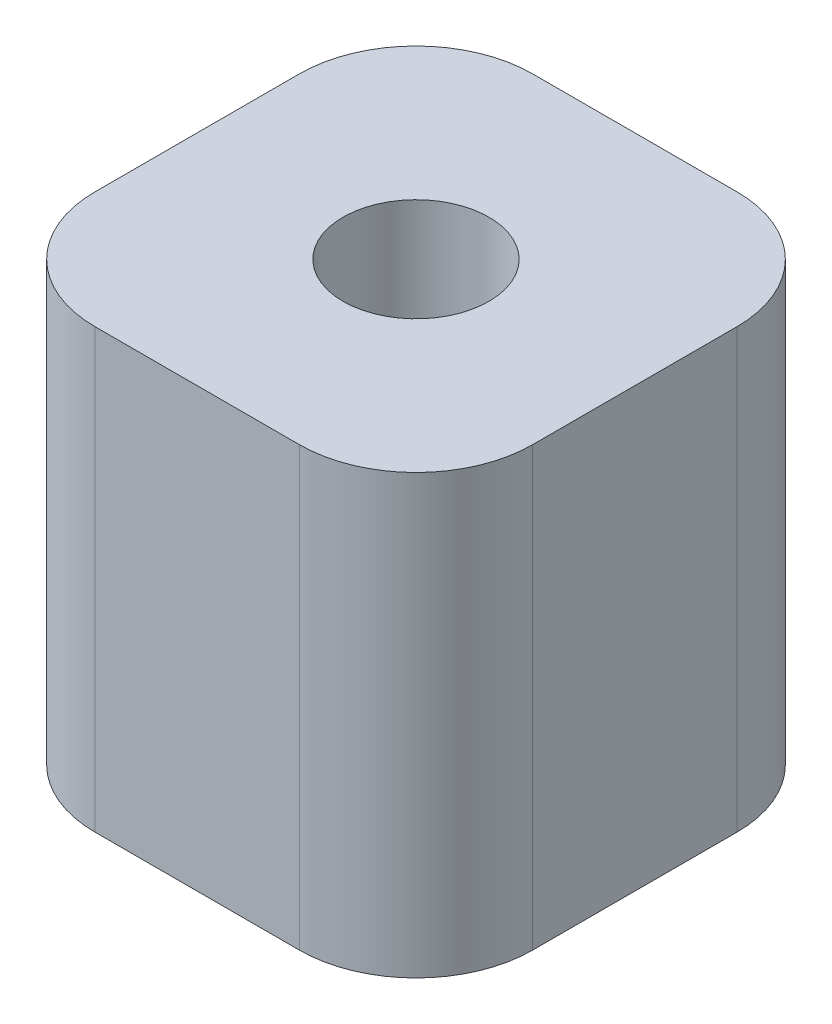
ISO-10303-21;
HEADER;
FILE_DESCRIPTION(('STEP AP214'),'2;1');
FILE_NAME('part.step','',(''),(''),'','','');
FILE_SCHEMA(('AUTOMOTIVE_DESIGN { 1 0 10303 214 1 1 1 1 }'));
ENDSEC;
DATA;
#1=APPLICATION_CONTEXT('core data for automotive mechanical design processes');
#2=APPLICATION_PROTOCOL_DEFINITION('international standard','automotive_design',2000,#1);
#3=PRODUCT_CONTEXT('',#1,'mechanical');
#4=PRODUCT('Part','Part','',(#3));
#5=PRODUCT_RELATED_PRODUCT_CATEGORY('part','',(#4));
#6=PRODUCT_DEFINITION_FORMATION('','',#4);
#7=PRODUCT_DEFINITION_CONTEXT('part definition',#1,'design');
#8=PRODUCT_DEFINITION('design','',#6,#7);
#9=PRODUCT_DEFINITION_SHAPE('','',#8);
#10=(LENGTH_UNIT() NAMED_UNIT(*) SI_UNIT(.MILLI.,.METRE.));
#11=(NAMED_UNIT(*) PLANE_ANGLE_UNIT() SI_UNIT($,.RADIAN.));
#12=(NAMED_UNIT(*) SI_UNIT($,.STERADIAN.) SOLID_ANGLE_UNIT());
#13=UNCERTAINTY_MEASURE_WITH_UNIT(LENGTH_MEASURE(1.E-05),#10,'distance_accuracy_value','');
#14=(GEOMETRIC_REPRESENTATION_CONTEXT(3) GLOBAL_UNCERTAINTY_ASSIGNED_CONTEXT((#13)) GLOBAL_UNIT_ASSIGNED_CONTEXT((#10,
#11,#12)) REPRESENTATION_CONTEXT('',''));
#15=CARTESIAN_POINT('',(0.,0.,0.));
#16=DIRECTION('',(0.,0.,1.));
#17=DIRECTION('',(1.,0.,0.));
#18=AXIS2_PLACEMENT_3D('',#15,#16,#17);
#19=CARTESIAN_POINT('',(1.75,7.5,-1.75));
#20=DIRECTION('',(0.,-1.,0.));
#21=DIRECTION('',(0.,0.,-1.));
#22=AXIS2_PLACEMENT_3D('',#19,#20,#21);
#23=CYLINDRICAL_SURFACE('',#22,2.);
#24=CARTESIAN_POINT('',(1.75,0.,-1.75));
#25=DIRECTION('',(0.,1.,0.));
#26=DIRECTION('',(0.,0.,-1.));
#27=AXIS2_PLACEMENT_3D('',#24,#25,#26);
#28=CIRCLE('',#27,2.);
#29=CARTESIAN_POINT('',(3.75,0.,-1.74999999999999));
#30=VERTEX_POINT('',#29);
#31=CARTESIAN_POINT('',(1.74999999999999,0.,-3.75));
#32=VERTEX_POINT('',#31);
#33=EDGE_CURVE('E134',#30,#32,#28,.T.);
#34=ORIENTED_EDGE('',*,*,#33,.T.);
#35=DIRECTION('',(0.,-1.,0.));
#36=VECTOR('',#35,1.);
#37=CARTESIAN_POINT('',(1.74999999999999,7.5,-3.75));
#38=LINE('',#37,#36);
#39=CARTESIAN_POINT('',(1.74999999999999,7.5,-3.75));
#40=VERTEX_POINT('',#39);
#41=EDGE_CURVE('E11',#40,#32,#38,.T.);
#42=ORIENTED_EDGE('',*,*,#41,.F.);
#43=CARTESIAN_POINT('',(1.75,7.5,-1.75));
#44=DIRECTION('',(0.,1.,0.));
#45=DIRECTION('',(0.,0.,-1.));
#46=AXIS2_PLACEMENT_3D('',#43,#44,#45);
#47=CIRCLE('',#46,2.);
#48=CARTESIAN_POINT('',(3.75,7.5,-1.74999999999999));
#49=VERTEX_POINT('',#48);
#50=EDGE_CURVE('E149',#49,#40,#47,.T.);
#51=ORIENTED_EDGE('',*,*,#50,.F.);
#52=DIRECTION('',(0.,-1.,0.));
#53=VECTOR('',#52,1.);
#54=CARTESIAN_POINT('',(3.75,7.5,-1.74999999999999));
#55=LINE('',#54,#53);
#56=EDGE_CURVE('E130',#49,#30,#55,.T.);
#57=ORIENTED_EDGE('',*,*,#56,.T.);
#58=EDGE_LOOP('',(#34,#42,#51,#57));
#59=FACE_BOUND('',#58,.T.);
#60=ADVANCED_FACE('F38',(#59),#23,.T.);
#61=CARTESIAN_POINT('',(-1.74999999999999,7.5,-3.75));
#62=DIRECTION('',(0.,0.,1.));
#63=DIRECTION('',(1.,0.,0.));
#64=AXIS2_PLACEMENT_3D('',#61,#62,#63);
#65=PLANE('',#64);
#66=DIRECTION('',(-1.,0.,0.));
#67=VECTOR('',#66,1.);
#68=CARTESIAN_POINT('',(-1.74999999999999,0.,-3.75));
#69=LINE('',#68,#67);
#70=CARTESIAN_POINT('',(-1.74999999999999,0.,-3.75));
#71=VERTEX_POINT('',#70);
#72=EDGE_CURVE('E137',#32,#71,#69,.T.);
#73=ORIENTED_EDGE('',*,*,#72,.T.);
#74=DIRECTION('',(0.,-1.,0.));
#75=VECTOR('',#74,1.);
#76=CARTESIAN_POINT('',(-1.74999999999999,7.5,-3.75));
#77=LINE('',#76,#75);
#78=CARTESIAN_POINT('',(-1.74999999999999,7.5,-3.75));
#79=VERTEX_POINT('',#78);
#80=EDGE_CURVE('E46',#79,#71,#77,.T.);
#81=ORIENTED_EDGE('',*,*,#80,.F.);
#82=DIRECTION('',(-1.,0.,0.));
#83=VECTOR('',#82,1.);
#84=CARTESIAN_POINT('',(-1.74999999999999,7.5,-3.75));
#85=LINE('',#84,#83);
#86=EDGE_CURVE('E97',#40,#79,#85,.T.);
#87=ORIENTED_EDGE('',*,*,#86,.F.);
#88=ORIENTED_EDGE('',*,*,#41,.T.);
#89=EDGE_LOOP('',(#73,#81,#87,#88));
#90=FACE_BOUND('',#89,.T.);
#91=ADVANCED_FACE('F206',(#90),#65,.F.);
#92=CARTESIAN_POINT('',(-1.75,7.5,-1.75));
#93=DIRECTION('',(0.,-1.,0.));
#94=DIRECTION('',(0.,0.,-1.));
#95=AXIS2_PLACEMENT_3D('',#92,#93,#94);
#96=CYLINDRICAL_SURFACE('',#95,2.);
#97=CARTESIAN_POINT('',(-1.75,0.,-1.75));
#98=DIRECTION('',(0.,1.,0.));
#99=DIRECTION('',(0.,0.,1.));
#100=AXIS2_PLACEMENT_3D('',#97,#98,#99);
#101=CIRCLE('',#100,2.);
#102=CARTESIAN_POINT('',(-3.75,0.,-1.74999999999999));
#103=VERTEX_POINT('',#102);
#104=EDGE_CURVE('E140',#71,#103,#101,.T.);
#105=ORIENTED_EDGE('',*,*,#104,.T.);
#106=DIRECTION('',(0.,-1.,0.));
#107=VECTOR('',#106,1.);
#108=CARTESIAN_POINT('',(-3.75,7.5,-1.74999999999999));
#109=LINE('',#108,#107);
#110=CARTESIAN_POINT('',(-3.75,7.5,-1.74999999999999));
#111=VERTEX_POINT('',#110);
#112=EDGE_CURVE('E156',#111,#103,#109,.T.);
#113=ORIENTED_EDGE('',*,*,#112,.F.);
#114=CARTESIAN_POINT('',(-1.75,7.5,-1.75));
#115=DIRECTION('',(0.,1.,0.));
#116=DIRECTION('',(0.,0.,1.));
#117=AXIS2_PLACEMENT_3D('',#114,#115,#116);
#118=CIRCLE('',#117,2.);
#119=EDGE_CURVE('E164',#79,#111,#118,.T.);
#120=ORIENTED_EDGE('',*,*,#119,.F.);
#121=ORIENTED_EDGE('',*,*,#80,.T.);
#122=EDGE_LOOP('',(#105,#113,#120,#121));
#123=FACE_BOUND('',#122,.T.);
#124=ADVANCED_FACE('F162',(#123),#96,.T.);
#125=CARTESIAN_POINT('',(-3.75,7.5,-1.74999999999999));
#126=DIRECTION('',(1.,0.,0.));
#127=DIRECTION('',(0.,0.,-1.));
#128=AXIS2_PLACEMENT_3D('',#125,#126,#127);
#129=PLANE('',#128);
#130=DIRECTION('',(0.,0.,1.));
#131=VECTOR('',#130,1.);
#132=CARTESIAN_POINT('',(-3.75,0.,-1.74999999999999));
#133=LINE('',#132,#131);
#134=CARTESIAN_POINT('',(-3.75,0.,1.74999999999999));
#135=VERTEX_POINT('',#134);
#136=EDGE_CURVE('E142',#103,#135,#133,.T.);
#137=ORIENTED_EDGE('',*,*,#136,.T.);
#138=DIRECTION('',(0.,-1.,0.));
#139=VECTOR('',#138,1.);
#140=CARTESIAN_POINT('',(-3.75,7.5,1.74999999999999));
#141=LINE('',#140,#139);
#142=CARTESIAN_POINT('',(-3.75,7.5,1.74999999999999));
#143=VERTEX_POINT('',#142);
#144=EDGE_CURVE('E153',#143,#135,#141,.T.);
#145=ORIENTED_EDGE('',*,*,#144,.F.);
#146=DIRECTION('',(0.,0.,1.));
#147=VECTOR('',#146,1.);
#148=CARTESIAN_POINT('',(-3.75,7.5,-1.74999999999999));
#149=LINE('',#148,#147);
#150=EDGE_CURVE('E176',#111,#143,#149,.T.);
#151=ORIENTED_EDGE('',*,*,#150,.F.);
#152=ORIENTED_EDGE('',*,*,#112,.T.);
#153=EDGE_LOOP('',(#137,#145,#151,#152));
#154=FACE_BOUND('',#153,.T.);
#155=ADVANCED_FACE('F172',(#154),#129,.F.);
#156=CARTESIAN_POINT('',(-1.75,7.5,1.75));
#157=DIRECTION('',(0.,-1.,0.));
#158=DIRECTION('',(0.,0.,-1.));
#159=AXIS2_PLACEMENT_3D('',#156,#157,#158);
#160=CYLINDRICAL_SURFACE('',#159,2.);
#161=CARTESIAN_POINT('',(-1.75,0.,1.75));
#162=DIRECTION('',(0.,1.,0.));
#163=DIRECTION('',(0.,0.,1.));
#164=AXIS2_PLACEMENT_3D('',#161,#162,#163);
#165=CIRCLE('',#164,2.);
#166=CARTESIAN_POINT('',(-1.75,0.,3.75));
#167=VERTEX_POINT('',#166);
#168=EDGE_CURVE('E144',#135,#167,#165,.T.);
#169=ORIENTED_EDGE('',*,*,#168,.T.);
#170=DIRECTION('',(0.,-1.,0.));
#171=VECTOR('',#170,1.);
#172=CARTESIAN_POINT('',(-1.75,7.5,3.75));
#173=LINE('',#172,#171);
#174=CARTESIAN_POINT('',(-1.75,7.5,3.75));
#175=VERTEX_POINT('',#174);
#176=EDGE_CURVE('E125',#175,#167,#173,.T.);
#177=ORIENTED_EDGE('',*,*,#176,.F.);
#178=CARTESIAN_POINT('',(-1.75,7.5,1.75));
#179=DIRECTION('',(0.,1.,0.));
#180=DIRECTION('',(0.,0.,1.));
#181=AXIS2_PLACEMENT_3D('',#178,#179,#180);
#182=CIRCLE('',#181,2.);
#183=EDGE_CURVE('E116',#143,#175,#182,.T.);
#184=ORIENTED_EDGE('',*,*,#183,.F.);
#185=ORIENTED_EDGE('',*,*,#144,.T.);
#186=EDGE_LOOP('',(#169,#177,#184,#185));
#187=FACE_BOUND('',#186,.T.);
#188=ADVANCED_FACE('F175',(#187),#160,.T.);
#189=CARTESIAN_POINT('',(-1.74999999999999,7.5,3.75));
#190=DIRECTION('',(0.,0.,-1.));
#191=DIRECTION('',(-1.,0.,0.));
#192=AXIS2_PLACEMENT_3D('',#189,#190,#191);
#193=PLANE('',#192);
#194=DIRECTION('',(1.,0.,0.));
#195=VECTOR('',#194,1.);
#196=CARTESIAN_POINT('',(-1.74999999999999,0.,3.75));
#197=LINE('',#196,#195);
#198=CARTESIAN_POINT('',(1.74999999999999,0.,3.75));
#199=VERTEX_POINT('',#198);
#200=EDGE_CURVE('E124',#167,#199,#197,.T.);
#201=ORIENTED_EDGE('',*,*,#200,.T.);
#202=DIRECTION('',(0.,-1.,0.));
#203=VECTOR('',#202,1.);
#204=CARTESIAN_POINT('',(1.74999999999999,7.5,3.75));
#205=LINE('',#204,#203);
#206=CARTESIAN_POINT('',(1.74999999999999,7.5,3.75));
#207=VERTEX_POINT('',#206);
#208=EDGE_CURVE('E121',#207,#199,#205,.T.);
#209=ORIENTED_EDGE('',*,*,#208,.F.);
#210=DIRECTION('',(1.,0.,0.));
#211=VECTOR('',#210,1.);
#212=CARTESIAN_POINT('',(-1.74999999999999,7.5,3.75));
#213=LINE('',#212,#211);
#214=EDGE_CURVE('E110',#175,#207,#213,.T.);
#215=ORIENTED_EDGE('',*,*,#214,.F.);
#216=ORIENTED_EDGE('',*,*,#176,.T.);
#217=EDGE_LOOP('',(#201,#209,#215,#216));
#218=FACE_BOUND('',#217,.T.);
#219=ADVANCED_FACE('F122',(#218),#193,.F.);
#220=CARTESIAN_POINT('',(1.75,7.5,1.75));
#221=DIRECTION('',(0.,-1.,0.));
#222=DIRECTION('',(0.,0.,-1.));
#223=AXIS2_PLACEMENT_3D('',#220,#221,#222);
#224=CYLINDRICAL_SURFACE('',#223,2.);
#225=CARTESIAN_POINT('',(1.75,0.,1.75));
#226=DIRECTION('',(0.,1.,0.));
#227=DIRECTION('',(0.,0.,1.));
#228=AXIS2_PLACEMENT_3D('',#225,#226,#227);
#229=CIRCLE('',#228,2.);
#230=CARTESIAN_POINT('',(3.75,0.,1.74999999999999));
#231=VERTEX_POINT('',#230);
#232=EDGE_CURVE('E83',#199,#231,#229,.T.);
#233=ORIENTED_EDGE('',*,*,#232,.T.);
#234=DIRECTION('',(0.,-1.,0.));
#235=VECTOR('',#234,1.);
#236=CARTESIAN_POINT('',(3.75,7.5,1.74999999999999));
#237=LINE('',#236,#235);
#238=CARTESIAN_POINT('',(3.75,7.5,1.74999999999999));
#239=VERTEX_POINT('',#238);
#240=EDGE_CURVE('E126',#239,#231,#237,.T.);
#241=ORIENTED_EDGE('',*,*,#240,.F.);
#242=CARTESIAN_POINT('',(1.75,7.5,1.75));
#243=DIRECTION('',(0.,1.,0.));
#244=DIRECTION('',(0.,0.,1.));
#245=AXIS2_PLACEMENT_3D('',#242,#243,#244);
#246=CIRCLE('',#245,2.);
#247=EDGE_CURVE('E114',#207,#239,#246,.T.);
#248=ORIENTED_EDGE('',*,*,#247,.F.);
#249=ORIENTED_EDGE('',*,*,#208,.T.);
#250=EDGE_LOOP('',(#233,#241,#248,#249));
#251=FACE_BOUND('',#250,.T.);
#252=ADVANCED_FACE('F128',(#251),#224,.T.);
#253=CARTESIAN_POINT('',(3.75,7.5,-1.74999999999999));
#254=DIRECTION('',(-1.,0.,0.));
#255=DIRECTION('',(0.,0.,1.));
#256=AXIS2_PLACEMENT_3D('',#253,#254,#255);
#257=PLANE('',#256);
#258=DIRECTION('',(0.,0.,-1.));
#259=VECTOR('',#258,1.);
#260=CARTESIAN_POINT('',(3.75,0.,-1.74999999999999));
#261=LINE('',#260,#259);
#262=EDGE_CURVE('E89',#231,#30,#261,.T.);
#263=ORIENTED_EDGE('',*,*,#262,.T.);
#264=ORIENTED_EDGE('',*,*,#56,.F.);
#265=DIRECTION('',(0.,0.,-1.));
#266=VECTOR('',#265,1.);
#267=CARTESIAN_POINT('',(3.75,7.5,-1.74999999999999));
#268=LINE('',#267,#266);
#269=EDGE_CURVE('E54',#239,#49,#268,.T.);
#270=ORIENTED_EDGE('',*,*,#269,.F.);
#271=ORIENTED_EDGE('',*,*,#240,.T.);
#272=EDGE_LOOP('',(#263,#264,#270,#271));
#273=FACE_BOUND('',#272,.T.);
#274=ADVANCED_FACE('F197',(#273),#257,.F.);
#275=CARTESIAN_POINT('',(1.75,7.5,-1.75));
#276=DIRECTION('',(0.,-1.,0.));
#277=DIRECTION('',(0.,0.,-1.));
#278=AXIS2_PLACEMENT_3D('',#275,#276,#277);
#279=PLANE('',#278);
#280=CARTESIAN_POINT('',(0.,7.5,0.));
#281=DIRECTION('',(0.,1.,0.));
#282=DIRECTION('',(0.,0.,1.));
#283=AXIS2_PLACEMENT_3D('',#280,#281,#282);
#284=CIRCLE('',#283,1.25);
#285=CARTESIAN_POINT('',(0.,7.5,1.25));
#286=VERTEX_POINT('',#285);
#287=EDGE_CURVE('E182',#286,#286,#284,.T.);
#288=ORIENTED_EDGE('',*,*,#287,.F.);
#289=EDGE_LOOP('',(#288));
#290=FACE_BOUND('',#289,.T.);
#291=ORIENTED_EDGE('',*,*,#50,.T.);
#292=ORIENTED_EDGE('',*,*,#86,.T.);
#293=ORIENTED_EDGE('',*,*,#119,.T.);
#294=ORIENTED_EDGE('',*,*,#150,.T.);
#295=ORIENTED_EDGE('',*,*,#183,.T.);
#296=ORIENTED_EDGE('',*,*,#214,.T.);
#297=ORIENTED_EDGE('',*,*,#247,.T.);
#298=ORIENTED_EDGE('',*,*,#269,.T.);
#299=EDGE_LOOP('',(#291,#292,#293,#294,#295,#296,#297,#298));
#300=FACE_BOUND('',#299,.T.);
#301=ADVANCED_FACE('F112',(#290,#300),#279,.F.);
#302=CARTESIAN_POINT('',(1.75,0.,-1.75));
#303=DIRECTION('',(0.,-1.,0.));
#304=DIRECTION('',(0.,0.,-1.));
#305=AXIS2_PLACEMENT_3D('',#302,#303,#304);
#306=PLANE('',#305);
#307=ORIENTED_EDGE('',*,*,#33,.F.);
#308=ORIENTED_EDGE('',*,*,#262,.F.);
#309=ORIENTED_EDGE('',*,*,#232,.F.);
#310=ORIENTED_EDGE('',*,*,#200,.F.);
#311=ORIENTED_EDGE('',*,*,#168,.F.);
#312=ORIENTED_EDGE('',*,*,#136,.F.);
#313=ORIENTED_EDGE('',*,*,#104,.F.);
#314=ORIENTED_EDGE('',*,*,#72,.F.);
#315=EDGE_LOOP('',(#307,#308,#309,#310,#311,#312,#313,#314));
#316=FACE_BOUND('',#315,.T.);
#317=ADVANCED_FACE('F168',(#316),#306,.T.);
#318=CARTESIAN_POINT('',(0.,5.,0.));
#319=DIRECTION('',(0.,1.,0.));
#320=DIRECTION('',(0.,0.,1.));
#321=AXIS2_PLACEMENT_3D('',#318,#319,#320);
#322=CYLINDRICAL_SURFACE('',#321,1.25);
#323=CARTESIAN_POINT('',(0.,5.,0.));
#324=DIRECTION('',(0.,1.,0.));
#325=DIRECTION('',(0.,0.,1.));
#326=AXIS2_PLACEMENT_3D('',#323,#324,#325);
#327=CIRCLE('',#326,1.25);
#328=CARTESIAN_POINT('',(0.,5.,1.25));
#329=VERTEX_POINT('',#328);
#330=EDGE_CURVE('E138',#329,#329,#327,.T.);
#331=ORIENTED_EDGE('',*,*,#330,.F.);
#332=EDGE_LOOP('',(#331));
#333=FACE_BOUND('',#332,.T.);
#334=ORIENTED_EDGE('',*,*,#287,.T.);
#335=EDGE_LOOP('',(#334));
#336=FACE_BOUND('',#335,.T.);
#337=ADVANCED_FACE('F190',(#333,#336),#322,.F.);
#338=CARTESIAN_POINT('',(0.,5.,0.));
#339=DIRECTION('',(0.,1.,0.));
#340=DIRECTION('',(0.,0.,1.));
#341=AXIS2_PLACEMENT_3D('',#338,#339,#340);
#342=PLANE('',#341);
#343=ORIENTED_EDGE('',*,*,#330,.T.);
#344=EDGE_LOOP('',(#343));
#345=FACE_BOUND('',#344,.T.);
#346=ADVANCED_FACE('F188',(#345),#342,.T.);
#347=CLOSED_SHELL('',(#60,#91,#124,#155,#188,#219,#252,#274,#301,#317,#337,#346));
#348=MANIFOLD_SOLID_BREP('B2',#347);
#349=ADVANCED_BREP_SHAPE_REPRESENTATION('',(#18,#348),#14);
#350=SHAPE_DEFINITION_REPRESENTATION(#9,#349);
ENDSEC;
END-ISO-10303-21;
